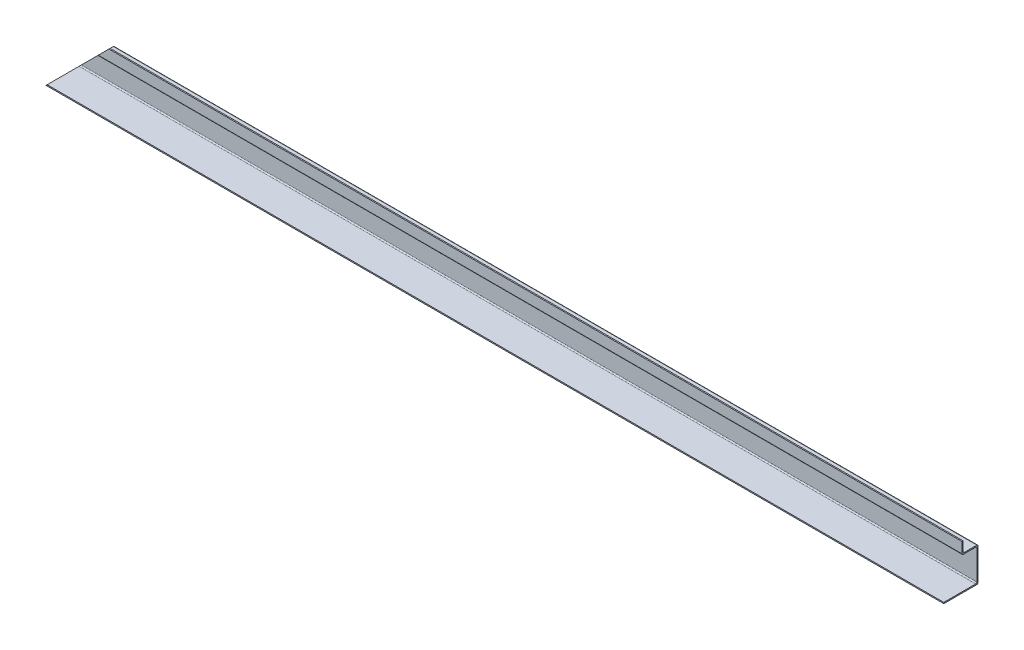
ISO-10303-21;
HEADER;
FILE_DESCRIPTION(('STEP AP214'),'2;1');
FILE_NAME('part.step','',(''),(''),'','','');
FILE_SCHEMA(('AUTOMOTIVE_DESIGN { 1 0 10303 214 1 1 1 1 }'));
ENDSEC;
DATA;
#1=APPLICATION_CONTEXT('core data for automotive mechanical design processes');
#2=APPLICATION_PROTOCOL_DEFINITION('international standard','automotive_design',2000,#1);
#3=PRODUCT_CONTEXT('',#1,'mechanical');
#4=PRODUCT('Part','Part','',(#3));
#5=PRODUCT_RELATED_PRODUCT_CATEGORY('part','',(#4));
#6=PRODUCT_DEFINITION_FORMATION('','',#4);
#7=PRODUCT_DEFINITION_CONTEXT('part definition',#1,'design');
#8=PRODUCT_DEFINITION('design','',#6,#7);
#9=PRODUCT_DEFINITION_SHAPE('','',#8);
#10=(LENGTH_UNIT() NAMED_UNIT(*) SI_UNIT(.MILLI.,.METRE.));
#11=(NAMED_UNIT(*) PLANE_ANGLE_UNIT() SI_UNIT($,.RADIAN.));
#12=(NAMED_UNIT(*) SI_UNIT($,.STERADIAN.) SOLID_ANGLE_UNIT());
#13=UNCERTAINTY_MEASURE_WITH_UNIT(LENGTH_MEASURE(1.E-05),#10,'distance_accuracy_value','');
#14=(GEOMETRIC_REPRESENTATION_CONTEXT(3) GLOBAL_UNCERTAINTY_ASSIGNED_CONTEXT((#13)) GLOBAL_UNIT_ASSIGNED_CONTEXT((#10,
#11,#12)) REPRESENTATION_CONTEXT('',''));
#15=CARTESIAN_POINT('',(0.,0.,0.));
#16=DIRECTION('',(0.,0.,1.));
#17=DIRECTION('',(1.,0.,0.));
#18=AXIS2_PLACEMENT_3D('',#15,#16,#17);
#19=CARTESIAN_POINT('',(2310.,0.,0.));
#20=DIRECTION('',(0.,0.,-1.));
#21=DIRECTION('',(-1.,0.,0.));
#22=AXIS2_PLACEMENT_3D('',#19,#20,#21);
#23=PLANE('',#22);
#24=DIRECTION('',(-1.,0.,0.));
#25=VECTOR('',#24,1.);
#26=CARTESIAN_POINT('',(2310.,0.,0.));
#27=LINE('',#26,#25);
#28=CARTESIAN_POINT('',(2310.,0.,0.));
#29=VERTEX_POINT('',#28);
#30=CARTESIAN_POINT('',(3.00000000000014,0.,0.));
#31=VERTEX_POINT('',#30);
#32=EDGE_CURVE('E161',#29,#31,#27,.T.);
#33=ORIENTED_EDGE('',*,*,#32,.T.);
#34=DIRECTION('',(-0.707106781186552,-0.707106781186543,0.));
#35=VECTOR('',#34,1.);
#36=CARTESIAN_POINT('',(0.,-3.,0.));
#37=LINE('',#36,#35);
#38=CARTESIAN_POINT('',(0.,-3.,0.));
#39=VERTEX_POINT('',#38);
#40=EDGE_CURVE('E146',#31,#39,#37,.T.);
#41=ORIENTED_EDGE('',*,*,#40,.T.);
#42=DIRECTION('',(-1.,0.,0.));
#43=VECTOR('',#42,1.);
#44=CARTESIAN_POINT('',(2310.,-3.,0.));
#45=LINE('',#44,#43);
#46=CARTESIAN_POINT('',(2310.,-3.,0.));
#47=VERTEX_POINT('',#46);
#48=EDGE_CURVE('E159',#47,#39,#45,.T.);
#49=ORIENTED_EDGE('',*,*,#48,.F.);
#50=DIRECTION('',(0.,-1.,0.));
#51=VECTOR('',#50,1.);
#52=CARTESIAN_POINT('',(2310.,0.,0.));
#53=LINE('',#52,#51);
#54=EDGE_CURVE('E153',#29,#47,#53,.T.);
#55=ORIENTED_EDGE('',*,*,#54,.F.);
#56=EDGE_LOOP('',(#33,#41,#49,#55));
#57=FACE_BOUND('',#56,.T.);
#58=ADVANCED_FACE('F33',(#57),#23,.F.);
#59=CARTESIAN_POINT('',(2310.,-3.,0.));
#60=DIRECTION('',(0.,1.,0.));
#61=DIRECTION('',(0.,0.,1.));
#62=AXIS2_PLACEMENT_3D('',#59,#60,#61);
#63=PLANE('',#62);
#64=DIRECTION('',(0.,0.,-1.));
#65=VECTOR('',#64,1.);
#66=CARTESIAN_POINT('',(0.,-3.,0.));
#67=LINE('',#66,#65);
#68=CARTESIAN_POINT('',(0.,-3.,-85.));
#69=VERTEX_POINT('',#68);
#70=EDGE_CURVE('E143',#39,#69,#67,.T.);
#71=ORIENTED_EDGE('',*,*,#70,.T.);
#72=DIRECTION('',(-1.,0.,0.));
#73=VECTOR('',#72,1.);
#74=CARTESIAN_POINT('',(2310.,-3.,-85.));
#75=LINE('',#74,#73);
#76=CARTESIAN_POINT('',(2310.,-3.,-85.));
#77=VERTEX_POINT('',#76);
#78=EDGE_CURVE('E181',#69,#77,#75,.F.);
#79=ORIENTED_EDGE('',*,*,#78,.T.);
#80=DIRECTION('',(0.,0.,-1.));
#81=VECTOR('',#80,1.);
#82=CARTESIAN_POINT('',(2310.,-3.,0.));
#83=LINE('',#82,#81);
#84=EDGE_CURVE('E167',#47,#77,#83,.T.);
#85=ORIENTED_EDGE('',*,*,#84,.F.);
#86=ORIENTED_EDGE('',*,*,#48,.T.);
#87=EDGE_LOOP('',(#71,#79,#85,#86));
#88=FACE_BOUND('',#87,.T.);
#89=ADVANCED_FACE('F165',(#88),#63,.F.);
#90=CARTESIAN_POINT('',(2310.,-3.,-88.));
#91=DIRECTION('',(0.,0.,1.));
#92=DIRECTION('',(1.,0.,0.));
#93=AXIS2_PLACEMENT_3D('',#90,#91,#92);
#94=PLANE('',#93);
#95=DIRECTION('',(-1.,0.,0.));
#96=VECTOR('',#95,1.);
#97=CARTESIAN_POINT('',(2310.,0.,-88.));
#98=LINE('',#97,#96);
#99=CARTESIAN_POINT('',(2310.,0.,-88.));
#100=VERTEX_POINT('',#99);
#101=CARTESIAN_POINT('',(3.00000000000014,0.,-88.));
#102=VERTEX_POINT('',#101);
#103=EDGE_CURVE('E172',#100,#102,#98,.T.);
#104=ORIENTED_EDGE('',*,*,#103,.T.);
#105=DIRECTION('',(-0.707106781186552,-0.707106781186543,0.));
#106=VECTOR('',#105,1.);
#107=CARTESIAN_POINT('',(0.,-3.,-88.));
#108=LINE('',#107,#106);
#109=CARTESIAN_POINT('',(85.0000000000013,82.0000000000001,-88.));
#110=VERTEX_POINT('',#109);
#111=EDGE_CURVE('E163',#110,#102,#108,.T.);
#112=ORIENTED_EDGE('',*,*,#111,.F.);
#113=DIRECTION('',(-1.,0.,0.));
#114=VECTOR('',#113,1.);
#115=CARTESIAN_POINT('',(2310.,82.,-88.));
#116=LINE('',#115,#114);
#117=CARTESIAN_POINT('',(2310.,82.,-88.));
#118=VERTEX_POINT('',#117);
#119=EDGE_CURVE('E169',#110,#118,#116,.F.);
#120=ORIENTED_EDGE('',*,*,#119,.T.);
#121=DIRECTION('',(0.,1.,0.));
#122=VECTOR('',#121,1.);
#123=CARTESIAN_POINT('',(2310.,-3.,-88.));
#124=LINE('',#123,#122);
#125=EDGE_CURVE('E261',#100,#118,#124,.T.);
#126=ORIENTED_EDGE('',*,*,#125,.F.);
#127=EDGE_LOOP('',(#104,#112,#120,#126));
#128=FACE_BOUND('',#127,.T.);
#129=ADVANCED_FACE('F298',(#128),#94,.F.);
#130=CARTESIAN_POINT('',(2310.,85.,-88.));
#131=DIRECTION('',(0.,-1.,0.));
#132=DIRECTION('',(0.,0.,-1.));
#133=AXIS2_PLACEMENT_3D('',#130,#131,#132);
#134=PLANE('',#133);
#135=DIRECTION('',(-1.,0.,0.));
#136=VECTOR('',#135,1.);
#137=CARTESIAN_POINT('',(2310.,85.,-85.));
#138=LINE('',#137,#136);
#139=CARTESIAN_POINT('',(2310.,85.,-85.));
#140=VERTEX_POINT('',#139);
#141=CARTESIAN_POINT('',(88.0000000000014,85.,-85.));
#142=VERTEX_POINT('',#141);
#143=EDGE_CURVE('E191',#140,#142,#138,.T.);
#144=ORIENTED_EDGE('',*,*,#143,.T.);
#145=DIRECTION('',(0.,0.,1.));
#146=VECTOR('',#145,1.);
#147=CARTESIAN_POINT('',(88.0000000000014,85.,-88.));
#148=LINE('',#147,#146);
#149=CARTESIAN_POINT('',(88.0000000000014,85.,-53.));
#150=VERTEX_POINT('',#149);
#151=EDGE_CURVE('E253',#142,#150,#148,.T.);
#152=ORIENTED_EDGE('',*,*,#151,.T.);
#153=DIRECTION('',(-1.,0.,0.));
#154=VECTOR('',#153,1.);
#155=CARTESIAN_POINT('',(2310.,85.,-53.));
#156=LINE('',#155,#154);
#157=CARTESIAN_POINT('',(2310.,85.,-53.));
#158=VERTEX_POINT('',#157);
#159=EDGE_CURVE('E189',#150,#158,#156,.F.);
#160=ORIENTED_EDGE('',*,*,#159,.T.);
#161=DIRECTION('',(0.,0.,1.));
#162=VECTOR('',#161,1.);
#163=CARTESIAN_POINT('',(2310.,85.,-88.));
#164=LINE('',#163,#162);
#165=EDGE_CURVE('E264',#140,#158,#164,.T.);
#166=ORIENTED_EDGE('',*,*,#165,.F.);
#167=EDGE_LOOP('',(#144,#152,#160,#166));
#168=FACE_BOUND('',#167,.T.);
#169=ADVANCED_FACE('F305',(#168),#134,.F.);
#170=CARTESIAN_POINT('',(2310.,85.,-50.));
#171=DIRECTION('',(0.,0.,1.));
#172=DIRECTION('',(1.,0.,0.));
#173=AXIS2_PLACEMENT_3D('',#170,#171,#172);
#174=PLANE('',#173);
#175=DIRECTION('',(-1.,0.,0.));
#176=VECTOR('',#175,1.);
#177=CARTESIAN_POINT('',(0.,88.,-50.));
#178=LINE('',#177,#176);
#179=CARTESIAN_POINT('',(2310.,88.,-50.));
#180=VERTEX_POINT('',#179);
#181=CARTESIAN_POINT('',(91.0000000000015,88.,-50.));
#182=VERTEX_POINT('',#181);
#183=EDGE_CURVE('E194',#180,#182,#178,.T.);
#184=ORIENTED_EDGE('',*,*,#183,.T.);
#185=DIRECTION('',(0.707106781186552,0.707106781186543,0.));
#186=VECTOR('',#185,1.);
#187=CARTESIAN_POINT('',(1199.00000000002,1196.,-50.));
#188=LINE('',#187,#186);
#189=CARTESIAN_POINT('',(115.000000000002,112.,-50.));
#190=VERTEX_POINT('',#189);
#191=EDGE_CURVE('E250',#182,#190,#188,.T.);
#192=ORIENTED_EDGE('',*,*,#191,.T.);
#193=DIRECTION('',(-1.,0.,0.));
#194=VECTOR('',#193,1.);
#195=CARTESIAN_POINT('',(2310.,112.,-50.));
#196=LINE('',#195,#194);
#197=CARTESIAN_POINT('',(2310.,112.,-50.));
#198=VERTEX_POINT('',#197);
#199=EDGE_CURVE('E170',#198,#190,#196,.T.);
#200=ORIENTED_EDGE('',*,*,#199,.F.);
#201=DIRECTION('',(0.,1.,0.));
#202=VECTOR('',#201,1.);
#203=CARTESIAN_POINT('',(2310.,85.,-50.));
#204=LINE('',#203,#202);
#205=EDGE_CURVE('E267',#180,#198,#204,.T.);
#206=ORIENTED_EDGE('',*,*,#205,.F.);
#207=EDGE_LOOP('',(#184,#192,#200,#206));
#208=FACE_BOUND('',#207,.T.);
#209=ADVANCED_FACE('F313',(#208),#174,.F.);
#210=CARTESIAN_POINT('',(2310.,112.,-47.));
#211=DIRECTION('',(0.,-1.,0.));
#212=DIRECTION('',(0.,0.,-1.));
#213=AXIS2_PLACEMENT_3D('',#210,#211,#212);
#214=PLANE('',#213);
#215=ORIENTED_EDGE('',*,*,#199,.T.);
#216=DIRECTION('',(0.,0.,-1.));
#217=VECTOR('',#216,1.);
#218=CARTESIAN_POINT('',(115.000000000002,112.,0.));
#219=LINE('',#218,#217);
#220=CARTESIAN_POINT('',(115.000000000002,112.,-47.));
#221=VERTEX_POINT('',#220);
#222=EDGE_CURVE('E162',#221,#190,#219,.T.);
#223=ORIENTED_EDGE('',*,*,#222,.F.);
#224=DIRECTION('',(-1.,0.,0.));
#225=VECTOR('',#224,1.);
#226=CARTESIAN_POINT('',(2310.,112.,-47.));
#227=LINE('',#226,#225);
#228=CARTESIAN_POINT('',(2310.,112.,-47.));
#229=VERTEX_POINT('',#228);
#230=EDGE_CURVE('E175',#229,#221,#227,.T.);
#231=ORIENTED_EDGE('',*,*,#230,.F.);
#232=DIRECTION('',(0.,0.,1.));
#233=VECTOR('',#232,1.);
#234=CARTESIAN_POINT('',(2310.,112.,-47.));
#235=LINE('',#234,#233);
#236=EDGE_CURVE('E269',#198,#229,#235,.T.);
#237=ORIENTED_EDGE('',*,*,#236,.F.);
#238=EDGE_LOOP('',(#215,#223,#231,#237));
#239=FACE_BOUND('',#238,.T.);
#240=ADVANCED_FACE('F285',(#239),#214,.F.);
#241=CARTESIAN_POINT('',(2310.,82.,-47.));
#242=DIRECTION('',(0.,0.,-1.));
#243=DIRECTION('',(-1.,0.,0.));
#244=AXIS2_PLACEMENT_3D('',#241,#242,#243);
#245=PLANE('',#244);
#246=ORIENTED_EDGE('',*,*,#230,.T.);
#247=DIRECTION('',(-0.707106781186552,-0.707106781186543,0.));
#248=VECTOR('',#247,1.);
#249=CARTESIAN_POINT('',(1197.50000000002,1194.5,-47.));
#250=LINE('',#249,#248);
#251=CARTESIAN_POINT('',(88.0000000000014,85.,-47.));
#252=VERTEX_POINT('',#251);
#253=EDGE_CURVE('E235',#221,#252,#250,.T.);
#254=ORIENTED_EDGE('',*,*,#253,.T.);
#255=DIRECTION('',(-1.,0.,0.));
#256=VECTOR('',#255,1.);
#257=CARTESIAN_POINT('',(2310.,85.,-47.));
#258=LINE('',#257,#256);
#259=CARTESIAN_POINT('',(2310.,85.,-47.));
#260=VERTEX_POINT('',#259);
#261=EDGE_CURVE('E210',#252,#260,#258,.F.);
#262=ORIENTED_EDGE('',*,*,#261,.T.);
#263=DIRECTION('',(0.,-1.,0.));
#264=VECTOR('',#263,1.);
#265=CARTESIAN_POINT('',(2310.,82.,-47.));
#266=LINE('',#265,#264);
#267=EDGE_CURVE('E271',#229,#260,#266,.T.);
#268=ORIENTED_EDGE('',*,*,#267,.F.);
#269=EDGE_LOOP('',(#246,#254,#262,#268));
#270=FACE_BOUND('',#269,.T.);
#271=ADVANCED_FACE('F280',(#270),#245,.F.);
#272=CARTESIAN_POINT('',(2310.,82.,-85.));
#273=DIRECTION('',(0.,1.,0.));
#274=DIRECTION('',(0.,0.,1.));
#275=AXIS2_PLACEMENT_3D('',#272,#273,#274);
#276=PLANE('',#275);
#277=DIRECTION('',(-1.,0.,0.));
#278=VECTOR('',#277,1.);
#279=CARTESIAN_POINT('',(2310.,82.,-50.));
#280=LINE('',#279,#278);
#281=CARTESIAN_POINT('',(2310.,82.,-50.));
#282=VERTEX_POINT('',#281);
#283=CARTESIAN_POINT('',(85.0000000000013,82.,-50.));
#284=VERTEX_POINT('',#283);
#285=EDGE_CURVE('E202',#282,#284,#280,.T.);
#286=ORIENTED_EDGE('',*,*,#285,.T.);
#287=DIRECTION('',(0.,0.,-1.));
#288=VECTOR('',#287,1.);
#289=CARTESIAN_POINT('',(85.0000000000013,82.,-85.));
#290=LINE('',#289,#288);
#291=CARTESIAN_POINT('',(85.0000000000013,82.,-82.));
#292=VERTEX_POINT('',#291);
#293=EDGE_CURVE('E47',#284,#292,#290,.T.);
#294=ORIENTED_EDGE('',*,*,#293,.T.);
#295=DIRECTION('',(-1.,0.,0.));
#296=VECTOR('',#295,1.);
#297=CARTESIAN_POINT('',(2310.,82.,-82.));
#298=LINE('',#297,#296);
#299=CARTESIAN_POINT('',(2310.,82.,-82.));
#300=VERTEX_POINT('',#299);
#301=EDGE_CURVE('E205',#292,#300,#298,.F.);
#302=ORIENTED_EDGE('',*,*,#301,.T.);
#303=DIRECTION('',(0.,0.,-1.));
#304=VECTOR('',#303,1.);
#305=CARTESIAN_POINT('',(2310.,82.,-85.));
#306=LINE('',#305,#304);
#307=EDGE_CURVE('E221',#282,#300,#306,.T.);
#308=ORIENTED_EDGE('',*,*,#307,.F.);
#309=EDGE_LOOP('',(#286,#294,#302,#308));
#310=FACE_BOUND('',#309,.T.);
#311=ADVANCED_FACE('F318',(#310),#276,.F.);
#312=CARTESIAN_POINT('',(2310.,0.,-85.));
#313=DIRECTION('',(0.,0.,-1.));
#314=DIRECTION('',(-1.,0.,0.));
#315=AXIS2_PLACEMENT_3D('',#312,#313,#314);
#316=PLANE('',#315);
#317=DIRECTION('',(-1.,0.,0.));
#318=VECTOR('',#317,1.);
#319=CARTESIAN_POINT('',(0.,79.,-85.));
#320=LINE('',#319,#318);
#321=CARTESIAN_POINT('',(2310.,79.,-85.));
#322=VERTEX_POINT('',#321);
#323=CARTESIAN_POINT('',(82.0000000000012,79.,-85.));
#324=VERTEX_POINT('',#323);
#325=EDGE_CURVE('E199',#322,#324,#320,.T.);
#326=ORIENTED_EDGE('',*,*,#325,.T.);
#327=DIRECTION('',(-0.707106781186552,-0.707106781186543,0.));
#328=VECTOR('',#327,1.);
#329=CARTESIAN_POINT('',(1156.50000000002,1153.5,-85.));
#330=LINE('',#329,#328);
#331=CARTESIAN_POINT('',(6.00000000000023,3.00000000000011,-85.));
#332=VERTEX_POINT('',#331);
#333=EDGE_CURVE('E234',#324,#332,#330,.T.);
#334=ORIENTED_EDGE('',*,*,#333,.T.);
#335=DIRECTION('',(-1.,0.,0.));
#336=VECTOR('',#335,1.);
#337=CARTESIAN_POINT('',(2310.,3.,-85.));
#338=LINE('',#337,#336);
#339=CARTESIAN_POINT('',(2310.,3.,-85.));
#340=VERTEX_POINT('',#339);
#341=EDGE_CURVE('E197',#332,#340,#338,.F.);
#342=ORIENTED_EDGE('',*,*,#341,.T.);
#343=DIRECTION('',(0.,-1.,0.));
#344=VECTOR('',#343,1.);
#345=CARTESIAN_POINT('',(2310.,0.,-85.));
#346=LINE('',#345,#344);
#347=EDGE_CURVE('E219',#322,#340,#346,.T.);
#348=ORIENTED_EDGE('',*,*,#347,.F.);
#349=EDGE_LOOP('',(#326,#334,#342,#348));
#350=FACE_BOUND('',#349,.T.);
#351=ADVANCED_FACE('F226',(#350),#316,.F.);
#352=CARTESIAN_POINT('',(2310.,0.,0.));
#353=DIRECTION('',(0.,-1.,0.));
#354=DIRECTION('',(0.,0.,-1.));
#355=AXIS2_PLACEMENT_3D('',#352,#353,#354);
#356=PLANE('',#355);
#357=DIRECTION('',(-1.,0.,0.));
#358=VECTOR('',#357,1.);
#359=CARTESIAN_POINT('',(0.,0.,-82.));
#360=LINE('',#359,#358);
#361=CARTESIAN_POINT('',(2310.,0.,-82.));
#362=VERTEX_POINT('',#361);
#363=CARTESIAN_POINT('',(3.00000000000019,0.,-82.));
#364=VERTEX_POINT('',#363);
#365=EDGE_CURVE('E207',#362,#364,#360,.T.);
#366=ORIENTED_EDGE('',*,*,#365,.T.);
#367=DIRECTION('',(0.,0.,1.));
#368=VECTOR('',#367,1.);
#369=CARTESIAN_POINT('',(3.00000000000011,0.,0.));
#370=LINE('',#369,#368);
#371=EDGE_CURVE('E245',#364,#31,#370,.T.);
#372=ORIENTED_EDGE('',*,*,#371,.T.);
#373=ORIENTED_EDGE('',*,*,#32,.F.);
#374=DIRECTION('',(0.,0.,1.));
#375=VECTOR('',#374,1.);
#376=CARTESIAN_POINT('',(2310.,0.,0.));
#377=LINE('',#376,#375);
#378=EDGE_CURVE('E229',#362,#29,#377,.T.);
#379=ORIENTED_EDGE('',*,*,#378,.F.);
#380=EDGE_LOOP('',(#366,#372,#373,#379));
#381=FACE_BOUND('',#380,.T.);
#382=ADVANCED_FACE('F325',(#381),#356,.F.);
#383=CARTESIAN_POINT('',(2310.,0.,0.));
#384=DIRECTION('',(1.,0.,0.));
#385=DIRECTION('',(0.,0.,-1.));
#386=AXIS2_PLACEMENT_3D('',#383,#384,#385);
#387=PLANE('',#386);
#388=ORIENTED_EDGE('',*,*,#84,.T.);
#389=CARTESIAN_POINT('',(2310.,0.,-85.));
#390=DIRECTION('',(1.,0.,0.));
#391=DIRECTION('',(0.,0.,-1.));
#392=AXIS2_PLACEMENT_3D('',#389,#390,#391);
#393=CIRCLE('',#392,3.);
#394=EDGE_CURVE('E187',#77,#100,#393,.T.);
#395=ORIENTED_EDGE('',*,*,#394,.T.);
#396=ORIENTED_EDGE('',*,*,#125,.T.);
#397=CARTESIAN_POINT('',(2310.,82.,-85.));
#398=DIRECTION('',(1.,0.,0.));
#399=DIRECTION('',(0.,0.,-1.));
#400=AXIS2_PLACEMENT_3D('',#397,#398,#399);
#401=CIRCLE('',#400,3.);
#402=EDGE_CURVE('E185',#118,#140,#401,.T.);
#403=ORIENTED_EDGE('',*,*,#402,.T.);
#404=ORIENTED_EDGE('',*,*,#165,.T.);
#405=CARTESIAN_POINT('',(2310.,88.,-53.));
#406=DIRECTION('',(1.,0.,0.));
#407=DIRECTION('',(0.,0.,-1.));
#408=AXIS2_PLACEMENT_3D('',#405,#406,#407);
#409=CIRCLE('',#408,3.);
#410=EDGE_CURVE('E212',#158,#180,#409,.F.);
#411=ORIENTED_EDGE('',*,*,#410,.T.);
#412=ORIENTED_EDGE('',*,*,#205,.T.);
#413=ORIENTED_EDGE('',*,*,#236,.T.);
#414=ORIENTED_EDGE('',*,*,#267,.T.);
#415=CARTESIAN_POINT('',(2310.,85.,-50.));
#416=DIRECTION('',(1.,0.,0.));
#417=DIRECTION('',(0.,0.,-1.));
#418=AXIS2_PLACEMENT_3D('',#415,#416,#417);
#419=CIRCLE('',#418,3.);
#420=EDGE_CURVE('E183',#260,#282,#419,.T.);
#421=ORIENTED_EDGE('',*,*,#420,.T.);
#422=ORIENTED_EDGE('',*,*,#307,.T.);
#423=CARTESIAN_POINT('',(2310.,79.,-82.));
#424=DIRECTION('',(1.,0.,0.));
#425=DIRECTION('',(0.,0.,-1.));
#426=AXIS2_PLACEMENT_3D('',#423,#424,#425);
#427=CIRCLE('',#426,3.);
#428=EDGE_CURVE('E214',#300,#322,#427,.F.);
#429=ORIENTED_EDGE('',*,*,#428,.T.);
#430=ORIENTED_EDGE('',*,*,#347,.T.);
#431=CARTESIAN_POINT('',(2310.,3.,-82.));
#432=DIRECTION('',(1.,0.,0.));
#433=DIRECTION('',(0.,0.,-1.));
#434=AXIS2_PLACEMENT_3D('',#431,#432,#433);
#435=CIRCLE('',#434,3.);
#436=EDGE_CURVE('E41',#340,#362,#435,.F.);
#437=ORIENTED_EDGE('',*,*,#436,.T.);
#438=ORIENTED_EDGE('',*,*,#378,.T.);
#439=ORIENTED_EDGE('',*,*,#54,.T.);
#440=EDGE_LOOP('',(#388,#395,#396,#403,#404,#411,#412,#413,#414,#421,#422,#429,#430,#437,#438,#439));
#441=FACE_BOUND('',#440,.T.);
#442=ADVANCED_FACE('F218',(#441),#387,.T.);
#443=CARTESIAN_POINT('',(2310.,0.,-85.));
#444=DIRECTION('',(-1.,0.,0.));
#445=DIRECTION('',(0.,0.,1.));
#446=AXIS2_PLACEMENT_3D('',#443,#444,#445);
#447=CYLINDRICAL_SURFACE('',#446,3.);
#448=CARTESIAN_POINT('',(3.00000000000011,0.,-85.));
#449=DIRECTION('',(0.707106781186543,-0.707106781186552,0.));
#450=DIRECTION('',(-0.707106781186552,-0.707106781186543,0.));
#451=AXIS2_PLACEMENT_3D('',#448,#449,#450);
#452=ELLIPSE('',#451,4.24264068711931,3.);
#453=EDGE_CURVE('E149',#102,#69,#452,.F.);
#454=ORIENTED_EDGE('',*,*,#453,.F.);
#455=ORIENTED_EDGE('',*,*,#103,.F.);
#456=ORIENTED_EDGE('',*,*,#394,.F.);
#457=ORIENTED_EDGE('',*,*,#78,.F.);
#458=EDGE_LOOP('',(#454,#455,#456,#457));
#459=FACE_BOUND('',#458,.T.);
#460=ADVANCED_FACE('F295',(#459),#447,.T.);
#461=CARTESIAN_POINT('',(2310.,82.,-85.));
#462=DIRECTION('',(-1.,0.,0.));
#463=DIRECTION('',(0.,0.,1.));
#464=AXIS2_PLACEMENT_3D('',#461,#462,#463);
#465=CYLINDRICAL_SURFACE('',#464,3.);
#466=CARTESIAN_POINT('',(85.0000000000013,82.,-85.));
#467=DIRECTION('',(0.707106781186543,-0.707106781186552,0.));
#468=DIRECTION('',(-0.707106781186552,-0.707106781186543,0.));
#469=AXIS2_PLACEMENT_3D('',#466,#467,#468);
#470=ELLIPSE('',#469,4.24264068711931,3.);
#471=EDGE_CURVE('E256',#142,#110,#470,.F.);
#472=ORIENTED_EDGE('',*,*,#471,.F.);
#473=ORIENTED_EDGE('',*,*,#143,.F.);
#474=ORIENTED_EDGE('',*,*,#402,.F.);
#475=ORIENTED_EDGE('',*,*,#119,.F.);
#476=EDGE_LOOP('',(#472,#473,#474,#475));
#477=FACE_BOUND('',#476,.T.);
#478=ADVANCED_FACE('F303',(#477),#465,.T.);
#479=CARTESIAN_POINT('',(2310.,88.,-53.));
#480=DIRECTION('',(1.,0.,0.));
#481=DIRECTION('',(0.,0.,-1.));
#482=AXIS2_PLACEMENT_3D('',#479,#480,#481);
#483=CYLINDRICAL_SURFACE('',#482,3.);
#484=ORIENTED_EDGE('',*,*,#159,.F.);
#485=CARTESIAN_POINT('',(91.0000000000015,88.,-53.));
#486=DIRECTION('',(0.707106781186543,-0.707106781186552,0.));
#487=DIRECTION('',(0.707106781186552,0.707106781186543,0.));
#488=AXIS2_PLACEMENT_3D('',#485,#486,#487);
#489=ELLIPSE('',#488,4.24264068711931,3.);
#490=EDGE_CURVE('E247',#150,#182,#489,.F.);
#491=ORIENTED_EDGE('',*,*,#490,.T.);
#492=ORIENTED_EDGE('',*,*,#183,.F.);
#493=ORIENTED_EDGE('',*,*,#410,.F.);
#494=EDGE_LOOP('',(#484,#491,#492,#493));
#495=FACE_BOUND('',#494,.T.);
#496=ADVANCED_FACE('F311',(#495),#483,.F.);
#497=CARTESIAN_POINT('',(2310.,79.,-82.));
#498=DIRECTION('',(1.,0.,0.));
#499=DIRECTION('',(0.,0.,-1.));
#500=AXIS2_PLACEMENT_3D('',#497,#498,#499);
#501=CYLINDRICAL_SURFACE('',#500,3.);
#502=ORIENTED_EDGE('',*,*,#301,.F.);
#503=CARTESIAN_POINT('',(82.0000000000012,79.,-82.));
#504=DIRECTION('',(0.707106781186543,-0.707106781186552,0.));
#505=DIRECTION('',(0.707106781186552,0.707106781186543,0.));
#506=AXIS2_PLACEMENT_3D('',#503,#504,#505);
#507=ELLIPSE('',#506,4.24264068711931,3.);
#508=EDGE_CURVE('E233',#292,#324,#507,.F.);
#509=ORIENTED_EDGE('',*,*,#508,.T.);
#510=ORIENTED_EDGE('',*,*,#325,.F.);
#511=ORIENTED_EDGE('',*,*,#428,.F.);
#512=EDGE_LOOP('',(#502,#509,#510,#511));
#513=FACE_BOUND('',#512,.T.);
#514=ADVANCED_FACE('F232',(#513),#501,.F.);
#515=CARTESIAN_POINT('',(2310.,3.,-82.));
#516=DIRECTION('',(1.,0.,0.));
#517=DIRECTION('',(0.,0.,-1.));
#518=AXIS2_PLACEMENT_3D('',#515,#516,#517);
#519=CYLINDRICAL_SURFACE('',#518,3.);
#520=ORIENTED_EDGE('',*,*,#341,.F.);
#521=CARTESIAN_POINT('',(6.00000000000023,3.,-82.));
#522=DIRECTION('',(0.707106781186543,-0.707106781186552,0.));
#523=DIRECTION('',(0.707106781186552,0.707106781186543,0.));
#524=AXIS2_PLACEMENT_3D('',#521,#522,#523);
#525=ELLIPSE('',#524,4.24264068711931,3.);
#526=EDGE_CURVE('E237',#332,#364,#525,.F.);
#527=ORIENTED_EDGE('',*,*,#526,.T.);
#528=ORIENTED_EDGE('',*,*,#365,.F.);
#529=ORIENTED_EDGE('',*,*,#436,.F.);
#530=EDGE_LOOP('',(#520,#527,#528,#529));
#531=FACE_BOUND('',#530,.T.);
#532=ADVANCED_FACE('F343',(#531),#519,.F.);
#533=CARTESIAN_POINT('',(2310.,85.,-50.));
#534=DIRECTION('',(-1.,0.,0.));
#535=DIRECTION('',(0.,0.,1.));
#536=AXIS2_PLACEMENT_3D('',#533,#534,#535);
#537=CYLINDRICAL_SURFACE('',#536,3.);
#538=CARTESIAN_POINT('',(88.0000000000014,85.,-50.));
#539=DIRECTION('',(0.707106781186543,-0.707106781186552,0.));
#540=DIRECTION('',(-0.707106781186552,-0.707106781186543,0.));
#541=AXIS2_PLACEMENT_3D('',#538,#539,#540);
#542=ELLIPSE('',#541,4.24264068711931,3.);
#543=EDGE_CURVE('E11',#284,#252,#542,.F.);
#544=ORIENTED_EDGE('',*,*,#543,.F.);
#545=ORIENTED_EDGE('',*,*,#285,.F.);
#546=ORIENTED_EDGE('',*,*,#420,.F.);
#547=ORIENTED_EDGE('',*,*,#261,.F.);
#548=EDGE_LOOP('',(#544,#545,#546,#547));
#549=FACE_BOUND('',#548,.T.);
#550=ADVANCED_FACE('F35',(#549),#537,.T.);
#551=CARTESIAN_POINT('',(0.,-3.,0.));
#552=DIRECTION('',(0.707106781186543,-0.707106781186552,0.));
#553=DIRECTION('',(0.707106781186552,0.707106781186543,0.));
#554=AXIS2_PLACEMENT_3D('',#551,#552,#553);
#555=PLANE('',#554);
#556=ORIENTED_EDGE('',*,*,#453,.T.);
#557=ORIENTED_EDGE('',*,*,#70,.F.);
#558=ORIENTED_EDGE('',*,*,#40,.F.);
#559=ORIENTED_EDGE('',*,*,#371,.F.);
#560=ORIENTED_EDGE('',*,*,#526,.F.);
#561=ORIENTED_EDGE('',*,*,#333,.F.);
#562=ORIENTED_EDGE('',*,*,#508,.F.);
#563=ORIENTED_EDGE('',*,*,#293,.F.);
#564=ORIENTED_EDGE('',*,*,#543,.T.);
#565=ORIENTED_EDGE('',*,*,#253,.F.);
#566=ORIENTED_EDGE('',*,*,#222,.T.);
#567=ORIENTED_EDGE('',*,*,#191,.F.);
#568=ORIENTED_EDGE('',*,*,#490,.F.);
#569=ORIENTED_EDGE('',*,*,#151,.F.);
#570=ORIENTED_EDGE('',*,*,#471,.T.);
#571=ORIENTED_EDGE('',*,*,#111,.T.);
#572=EDGE_LOOP('',(#556,#557,#558,#559,#560,#561,#562,#563,#564,#565,#566,#567,#568,#569,#570,#571));
#573=FACE_BOUND('',#572,.T.);
#574=ADVANCED_FACE('F145',(#573),#555,.F.);
#575=CLOSED_SHELL('',(#58,#89,#129,#169,#209,#240,#271,#311,#351,#382,#442,#460,#478,#496,#514,
#532,#550,#574));
#576=MANIFOLD_SOLID_BREP('B2',#575);
#577=ADVANCED_BREP_SHAPE_REPRESENTATION('',(#18,#576),#14);
#578=SHAPE_DEFINITION_REPRESENTATION(#9,#577);
ENDSEC;
END-ISO-10303-21;
